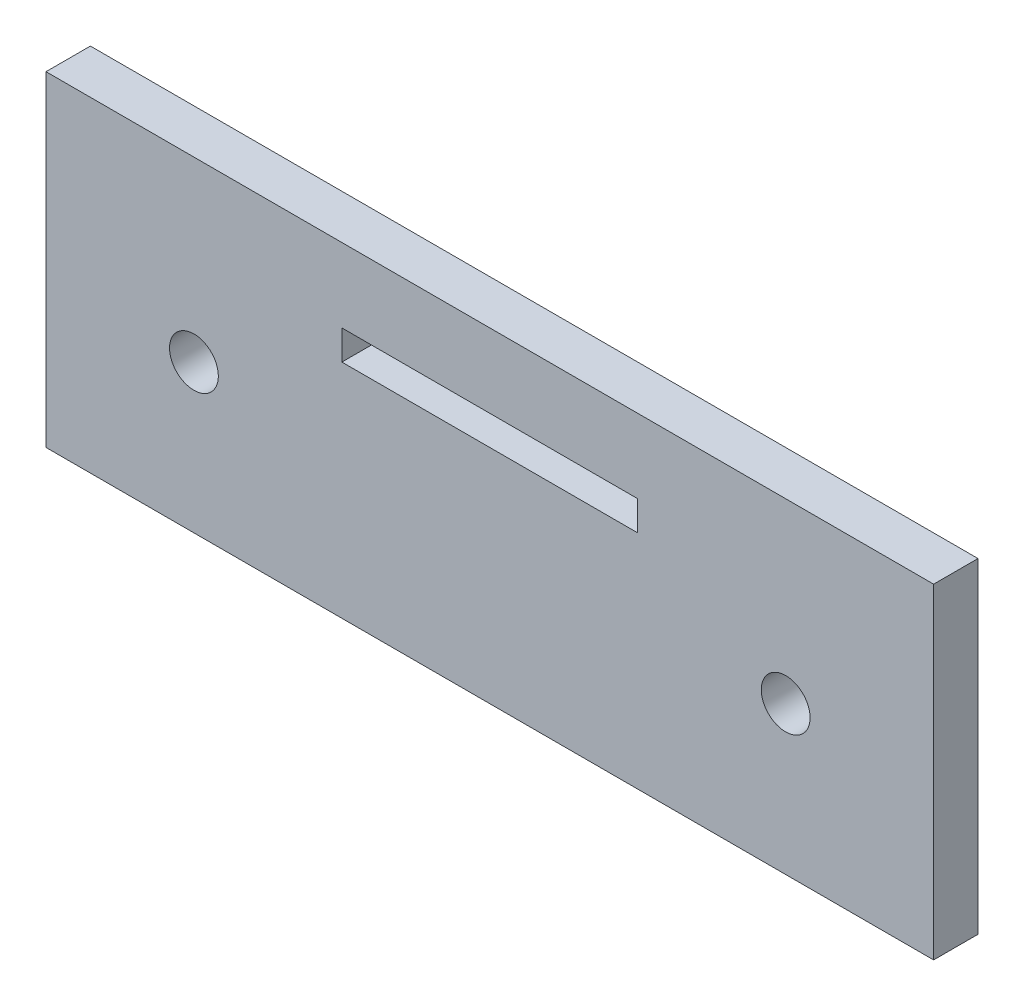
ISO-10303-21;
HEADER;
FILE_DESCRIPTION(('STEP AP214'),'2;1');
FILE_NAME('part.step','',(''),(''),'','','');
FILE_SCHEMA(('AUTOMOTIVE_DESIGN { 1 0 10303 214 1 1 1 1 }'));
ENDSEC;
DATA;
#1=APPLICATION_CONTEXT('core data for automotive mechanical design processes');
#2=APPLICATION_PROTOCOL_DEFINITION('international standard','automotive_design',2000,#1);
#3=PRODUCT_CONTEXT('',#1,'mechanical');
#4=PRODUCT('Part','Part','',(#3));
#5=PRODUCT_RELATED_PRODUCT_CATEGORY('part','',(#4));
#6=PRODUCT_DEFINITION_FORMATION('','',#4);
#7=PRODUCT_DEFINITION_CONTEXT('part definition',#1,'design');
#8=PRODUCT_DEFINITION('design','',#6,#7);
#9=PRODUCT_DEFINITION_SHAPE('','',#8);
#10=(LENGTH_UNIT() NAMED_UNIT(*) SI_UNIT(.MILLI.,.METRE.));
#11=(NAMED_UNIT(*) PLANE_ANGLE_UNIT() SI_UNIT($,.RADIAN.));
#12=(NAMED_UNIT(*) SI_UNIT($,.STERADIAN.) SOLID_ANGLE_UNIT());
#13=UNCERTAINTY_MEASURE_WITH_UNIT(LENGTH_MEASURE(1.E-05),#10,'distance_accuracy_value','');
#14=(GEOMETRIC_REPRESENTATION_CONTEXT(3) GLOBAL_UNCERTAINTY_ASSIGNED_CONTEXT((#13)) GLOBAL_UNIT_ASSIGNED_CONTEXT((#10,
#11,#12)) REPRESENTATION_CONTEXT('',''));
#15=CARTESIAN_POINT('',(0.,0.,0.));
#16=DIRECTION('',(0.,0.,1.));
#17=DIRECTION('',(1.,0.,0.));
#18=AXIS2_PLACEMENT_3D('',#15,#16,#17);
#19=CARTESIAN_POINT('',(0.,0.,-3.));
#20=DIRECTION('',(-1.,0.,0.));
#21=DIRECTION('',(0.,0.,1.));
#22=AXIS2_PLACEMENT_3D('',#19,#20,#21);
#23=PLANE('',#22);
#24=DIRECTION('',(0.,-1.,0.));
#25=VECTOR('',#24,1.);
#26=CARTESIAN_POINT('',(0.,0.,0.));
#27=LINE('',#26,#25);
#28=CARTESIAN_POINT('',(0.,22.,0.));
#29=VERTEX_POINT('',#28);
#30=CARTESIAN_POINT('',(0.,0.,0.));
#31=VERTEX_POINT('',#30);
#32=EDGE_CURVE('E159',#29,#31,#27,.T.);
#33=ORIENTED_EDGE('',*,*,#32,.F.);
#34=DIRECTION('',(0.,0.,1.));
#35=VECTOR('',#34,1.);
#36=CARTESIAN_POINT('',(0.,22.,-3.));
#37=LINE('',#36,#35);
#38=CARTESIAN_POINT('',(0.,22.,-3.));
#39=VERTEX_POINT('',#38);
#40=EDGE_CURVE('E11',#39,#29,#37,.T.);
#41=ORIENTED_EDGE('',*,*,#40,.F.);
#42=DIRECTION('',(0.,-1.,0.));
#43=VECTOR('',#42,1.);
#44=CARTESIAN_POINT('',(0.,0.,-3.));
#45=LINE('',#44,#43);
#46=CARTESIAN_POINT('',(0.,0.,-3.));
#47=VERTEX_POINT('',#46);
#48=EDGE_CURVE('E160',#39,#47,#45,.T.);
#49=ORIENTED_EDGE('',*,*,#48,.T.);
#50=DIRECTION('',(0.,0.,1.));
#51=VECTOR('',#50,1.);
#52=CARTESIAN_POINT('',(0.,0.,-3.));
#53=LINE('',#52,#51);
#54=EDGE_CURVE('E50',#47,#31,#53,.T.);
#55=ORIENTED_EDGE('',*,*,#54,.T.);
#56=EDGE_LOOP('',(#33,#41,#49,#55));
#57=FACE_BOUND('',#56,.T.);
#58=ADVANCED_FACE('F47',(#57),#23,.T.);
#59=CARTESIAN_POINT('',(0.,22.,-3.));
#60=DIRECTION('',(0.,1.,0.));
#61=DIRECTION('',(-1.,0.,0.));
#62=AXIS2_PLACEMENT_3D('',#59,#60,#61);
#63=PLANE('',#62);
#64=DIRECTION('',(-1.,0.,0.));
#65=VECTOR('',#64,1.);
#66=CARTESIAN_POINT('',(0.,22.,0.));
#67=LINE('',#66,#65);
#68=CARTESIAN_POINT('',(60.,22.,0.));
#69=VERTEX_POINT('',#68);
#70=EDGE_CURVE('E165',#69,#29,#67,.T.);
#71=ORIENTED_EDGE('',*,*,#70,.F.);
#72=DIRECTION('',(0.,0.,1.));
#73=VECTOR('',#72,1.);
#74=CARTESIAN_POINT('',(60.,22.,-3.));
#75=LINE('',#74,#73);
#76=CARTESIAN_POINT('',(60.,22.,-3.));
#77=VERTEX_POINT('',#76);
#78=EDGE_CURVE('E56',#77,#69,#75,.T.);
#79=ORIENTED_EDGE('',*,*,#78,.F.);
#80=DIRECTION('',(-1.,0.,0.));
#81=VECTOR('',#80,1.);
#82=CARTESIAN_POINT('',(0.,22.,-3.));
#83=LINE('',#82,#81);
#84=EDGE_CURVE('E173',#77,#39,#83,.T.);
#85=ORIENTED_EDGE('',*,*,#84,.T.);
#86=ORIENTED_EDGE('',*,*,#40,.T.);
#87=EDGE_LOOP('',(#71,#79,#85,#86));
#88=FACE_BOUND('',#87,.T.);
#89=ADVANCED_FACE('F205',(#88),#63,.T.);
#90=CARTESIAN_POINT('',(60.,0.,-3.));
#91=DIRECTION('',(1.,0.,0.));
#92=DIRECTION('',(0.,0.,-1.));
#93=AXIS2_PLACEMENT_3D('',#90,#91,#92);
#94=PLANE('',#93);
#95=DIRECTION('',(0.,1.,0.));
#96=VECTOR('',#95,1.);
#97=CARTESIAN_POINT('',(60.,0.,0.));
#98=LINE('',#97,#96);
#99=CARTESIAN_POINT('',(60.,0.,0.));
#100=VERTEX_POINT('',#99);
#101=EDGE_CURVE('E184',#100,#69,#98,.T.);
#102=ORIENTED_EDGE('',*,*,#101,.F.);
#103=DIRECTION('',(0.,0.,1.));
#104=VECTOR('',#103,1.);
#105=CARTESIAN_POINT('',(60.,0.,-3.));
#106=LINE('',#105,#104);
#107=CARTESIAN_POINT('',(60.,0.,-3.));
#108=VERTEX_POINT('',#107);
#109=EDGE_CURVE('E192',#108,#100,#106,.T.);
#110=ORIENTED_EDGE('',*,*,#109,.F.);
#111=DIRECTION('',(0.,1.,0.));
#112=VECTOR('',#111,1.);
#113=CARTESIAN_POINT('',(60.,0.,-3.));
#114=LINE('',#113,#112);
#115=EDGE_CURVE('E169',#108,#77,#114,.T.);
#116=ORIENTED_EDGE('',*,*,#115,.T.);
#117=ORIENTED_EDGE('',*,*,#78,.T.);
#118=EDGE_LOOP('',(#102,#110,#116,#117));
#119=FACE_BOUND('',#118,.T.);
#120=ADVANCED_FACE('F211',(#119),#94,.T.);
#121=CARTESIAN_POINT('',(0.,0.,-3.));
#122=DIRECTION('',(0.,-1.,0.));
#123=DIRECTION('',(0.,0.,-1.));
#124=AXIS2_PLACEMENT_3D('',#121,#122,#123);
#125=PLANE('',#124);
#126=DIRECTION('',(1.,0.,0.));
#127=VECTOR('',#126,1.);
#128=CARTESIAN_POINT('',(0.,0.,0.));
#129=LINE('',#128,#127);
#130=EDGE_CURVE('E180',#31,#100,#129,.T.);
#131=ORIENTED_EDGE('',*,*,#130,.F.);
#132=ORIENTED_EDGE('',*,*,#54,.F.);
#133=DIRECTION('',(1.,0.,0.));
#134=VECTOR('',#133,1.);
#135=CARTESIAN_POINT('',(0.,0.,-3.));
#136=LINE('',#135,#134);
#137=EDGE_CURVE('E164',#47,#108,#136,.T.);
#138=ORIENTED_EDGE('',*,*,#137,.T.);
#139=ORIENTED_EDGE('',*,*,#109,.T.);
#140=EDGE_LOOP('',(#131,#132,#138,#139));
#141=FACE_BOUND('',#140,.T.);
#142=ADVANCED_FACE('F202',(#141),#125,.T.);
#143=CARTESIAN_POINT('',(0.,0.,-3.));
#144=DIRECTION('',(0.,0.,-1.));
#145=DIRECTION('',(-1.,0.,0.));
#146=AXIS2_PLACEMENT_3D('',#143,#144,#145);
#147=PLANE('',#146);
#148=CARTESIAN_POINT('',(10.,10.,-3.));
#149=DIRECTION('',(0.,0.,-1.));
#150=DIRECTION('',(-1.,0.,0.));
#151=AXIS2_PLACEMENT_3D('',#148,#149,#150);
#152=CIRCLE('',#151,1.65);
#153=CARTESIAN_POINT('',(8.35,10.,-3.));
#154=VERTEX_POINT('',#153);
#155=EDGE_CURVE('E342',#154,#154,#152,.T.);
#156=ORIENTED_EDGE('',*,*,#155,.F.);
#157=EDGE_LOOP('',(#156));
#158=FACE_BOUND('',#157,.T.);
#159=CARTESIAN_POINT('',(50.,10.,-3.));
#160=DIRECTION('',(0.,0.,-1.));
#161=DIRECTION('',(-1.,0.,0.));
#162=AXIS2_PLACEMENT_3D('',#159,#160,#161);
#163=CIRCLE('',#162,1.65);
#164=CARTESIAN_POINT('',(48.35,10.,-3.));
#165=VERTEX_POINT('',#164);
#166=EDGE_CURVE('E347',#165,#165,#163,.T.);
#167=ORIENTED_EDGE('',*,*,#166,.F.);
#168=EDGE_LOOP('',(#167));
#169=FACE_BOUND('',#168,.T.);
#170=DIRECTION('',(0.,1.,0.));
#171=VECTOR('',#170,1.);
#172=CARTESIAN_POINT('',(20.,0.,-3.));
#173=LINE('',#172,#171);
#174=CARTESIAN_POINT('',(20.,15.,-3.));
#175=VERTEX_POINT('',#174);
#176=CARTESIAN_POINT('',(20.,17.,-3.));
#177=VERTEX_POINT('',#176);
#178=EDGE_CURVE('E156',#175,#177,#173,.T.);
#179=ORIENTED_EDGE('',*,*,#178,.F.);
#180=DIRECTION('',(-1.,0.,0.));
#181=VECTOR('',#180,1.);
#182=CARTESIAN_POINT('',(0.,15.,-3.));
#183=LINE('',#182,#181);
#184=CARTESIAN_POINT('',(40.,15.,-3.));
#185=VERTEX_POINT('',#184);
#186=EDGE_CURVE('E144',#185,#175,#183,.T.);
#187=ORIENTED_EDGE('',*,*,#186,.F.);
#188=DIRECTION('',(0.,-1.,0.));
#189=VECTOR('',#188,1.);
#190=CARTESIAN_POINT('',(40.,0.,-3.));
#191=LINE('',#190,#189);
#192=CARTESIAN_POINT('',(40.,17.,-3.));
#193=VERTEX_POINT('',#192);
#194=EDGE_CURVE('E119',#193,#185,#191,.T.);
#195=ORIENTED_EDGE('',*,*,#194,.F.);
#196=DIRECTION('',(1.,0.,0.));
#197=VECTOR('',#196,1.);
#198=CARTESIAN_POINT('',(0.,17.,-3.));
#199=LINE('',#198,#197);
#200=EDGE_CURVE('E153',#177,#193,#199,.T.);
#201=ORIENTED_EDGE('',*,*,#200,.F.);
#202=EDGE_LOOP('',(#179,#187,#195,#201));
#203=FACE_BOUND('',#202,.T.);
#204=ORIENTED_EDGE('',*,*,#48,.F.);
#205=ORIENTED_EDGE('',*,*,#84,.F.);
#206=ORIENTED_EDGE('',*,*,#115,.F.);
#207=ORIENTED_EDGE('',*,*,#137,.F.);
#208=EDGE_LOOP('',(#204,#205,#206,#207));
#209=FACE_BOUND('',#208,.T.);
#210=ADVANCED_FACE('F208',(#158,#169,#203,#209),#147,.T.);
#211=CARTESIAN_POINT('',(0.,0.,0.));
#212=DIRECTION('',(0.,0.,-1.));
#213=DIRECTION('',(-1.,0.,0.));
#214=AXIS2_PLACEMENT_3D('',#211,#212,#213);
#215=PLANE('',#214);
#216=CARTESIAN_POINT('',(10.,10.,0.));
#217=DIRECTION('',(0.,0.,1.));
#218=DIRECTION('',(1.,0.,0.));
#219=AXIS2_PLACEMENT_3D('',#216,#217,#218);
#220=CIRCLE('',#219,1.65);
#221=CARTESIAN_POINT('',(11.65,10.,0.));
#222=VERTEX_POINT('',#221);
#223=EDGE_CURVE('E345',#222,#222,#220,.T.);
#224=ORIENTED_EDGE('',*,*,#223,.F.);
#225=EDGE_LOOP('',(#224));
#226=FACE_BOUND('',#225,.T.);
#227=CARTESIAN_POINT('',(50.,10.,0.));
#228=DIRECTION('',(0.,0.,1.));
#229=DIRECTION('',(1.,0.,0.));
#230=AXIS2_PLACEMENT_3D('',#227,#228,#229);
#231=CIRCLE('',#230,1.65);
#232=CARTESIAN_POINT('',(51.65,10.,0.));
#233=VERTEX_POINT('',#232);
#234=EDGE_CURVE('E348',#233,#233,#231,.T.);
#235=ORIENTED_EDGE('',*,*,#234,.F.);
#236=EDGE_LOOP('',(#235));
#237=FACE_BOUND('',#236,.T.);
#238=DIRECTION('',(1.,0.,0.));
#239=VECTOR('',#238,1.);
#240=CARTESIAN_POINT('',(20.,15.,0.));
#241=LINE('',#240,#239);
#242=CARTESIAN_POINT('',(20.,15.,0.));
#243=VERTEX_POINT('',#242);
#244=CARTESIAN_POINT('',(40.,15.,0.));
#245=VERTEX_POINT('',#244);
#246=EDGE_CURVE('E126',#243,#245,#241,.T.);
#247=ORIENTED_EDGE('',*,*,#246,.F.);
#248=DIRECTION('',(0.,-1.,0.));
#249=VECTOR('',#248,1.);
#250=CARTESIAN_POINT('',(20.,17.,0.));
#251=LINE('',#250,#249);
#252=CARTESIAN_POINT('',(20.,17.,0.));
#253=VERTEX_POINT('',#252);
#254=EDGE_CURVE('E72',#253,#243,#251,.T.);
#255=ORIENTED_EDGE('',*,*,#254,.F.);
#256=DIRECTION('',(-1.,0.,0.));
#257=VECTOR('',#256,1.);
#258=CARTESIAN_POINT('',(20.,17.,0.));
#259=LINE('',#258,#257);
#260=CARTESIAN_POINT('',(40.,17.,0.));
#261=VERTEX_POINT('',#260);
#262=EDGE_CURVE('E134',#261,#253,#259,.T.);
#263=ORIENTED_EDGE('',*,*,#262,.F.);
#264=DIRECTION('',(0.,1.,0.));
#265=VECTOR('',#264,1.);
#266=CARTESIAN_POINT('',(40.,17.,0.));
#267=LINE('',#266,#265);
#268=EDGE_CURVE('E116',#245,#261,#267,.T.);
#269=ORIENTED_EDGE('',*,*,#268,.F.);
#270=EDGE_LOOP('',(#247,#255,#263,#269));
#271=FACE_BOUND('',#270,.T.);
#272=ORIENTED_EDGE('',*,*,#32,.T.);
#273=ORIENTED_EDGE('',*,*,#130,.T.);
#274=ORIENTED_EDGE('',*,*,#101,.T.);
#275=ORIENTED_EDGE('',*,*,#70,.T.);
#276=EDGE_LOOP('',(#272,#273,#274,#275));
#277=FACE_BOUND('',#276,.T.);
#278=ADVANCED_FACE('F131',(#226,#237,#271,#277),#215,.F.);
#279=CARTESIAN_POINT('',(20.,17.,-30.));
#280=DIRECTION('',(-1.,0.,0.));
#281=DIRECTION('',(0.,-1.,0.));
#282=AXIS2_PLACEMENT_3D('',#279,#280,#281);
#283=PLANE('',#282);
#284=ORIENTED_EDGE('',*,*,#178,.T.);
#285=DIRECTION('',(0.,0.,1.));
#286=VECTOR('',#285,1.);
#287=CARTESIAN_POINT('',(20.,17.,-30.));
#288=LINE('',#287,#286);
#289=EDGE_CURVE('E141',#177,#253,#288,.T.);
#290=ORIENTED_EDGE('',*,*,#289,.T.);
#291=ORIENTED_EDGE('',*,*,#254,.T.);
#292=DIRECTION('',(0.,0.,1.));
#293=VECTOR('',#292,1.);
#294=CARTESIAN_POINT('',(20.,15.,-30.));
#295=LINE('',#294,#293);
#296=EDGE_CURVE('E123',#175,#243,#295,.T.);
#297=ORIENTED_EDGE('',*,*,#296,.F.);
#298=EDGE_LOOP('',(#284,#290,#291,#297));
#299=FACE_BOUND('',#298,.T.);
#300=ADVANCED_FACE('F262',(#299),#283,.F.);
#301=CARTESIAN_POINT('',(20.,17.,-30.));
#302=DIRECTION('',(0.,1.,0.));
#303=DIRECTION('',(0.,0.,1.));
#304=AXIS2_PLACEMENT_3D('',#301,#302,#303);
#305=PLANE('',#304);
#306=ORIENTED_EDGE('',*,*,#200,.T.);
#307=DIRECTION('',(0.,0.,1.));
#308=VECTOR('',#307,1.);
#309=CARTESIAN_POINT('',(40.,17.,-30.));
#310=LINE('',#309,#308);
#311=EDGE_CURVE('E122',#193,#261,#310,.T.);
#312=ORIENTED_EDGE('',*,*,#311,.T.);
#313=ORIENTED_EDGE('',*,*,#262,.T.);
#314=ORIENTED_EDGE('',*,*,#289,.F.);
#315=EDGE_LOOP('',(#306,#312,#313,#314));
#316=FACE_BOUND('',#315,.T.);
#317=ADVANCED_FACE('F273',(#316),#305,.F.);
#318=CARTESIAN_POINT('',(40.,17.,-30.));
#319=DIRECTION('',(1.,0.,0.));
#320=DIRECTION('',(0.,0.,-1.));
#321=AXIS2_PLACEMENT_3D('',#318,#319,#320);
#322=PLANE('',#321);
#323=ORIENTED_EDGE('',*,*,#194,.T.);
#324=DIRECTION('',(0.,0.,1.));
#325=VECTOR('',#324,1.);
#326=CARTESIAN_POINT('',(40.,15.,-30.));
#327=LINE('',#326,#325);
#328=EDGE_CURVE('E64',#185,#245,#327,.T.);
#329=ORIENTED_EDGE('',*,*,#328,.T.);
#330=ORIENTED_EDGE('',*,*,#268,.T.);
#331=ORIENTED_EDGE('',*,*,#311,.F.);
#332=EDGE_LOOP('',(#323,#329,#330,#331));
#333=FACE_BOUND('',#332,.T.);
#334=ADVANCED_FACE('F113',(#333),#322,.F.);
#335=CARTESIAN_POINT('',(20.,15.,-30.));
#336=DIRECTION('',(0.,-1.,0.));
#337=DIRECTION('',(0.,0.,-1.));
#338=AXIS2_PLACEMENT_3D('',#335,#336,#337);
#339=PLANE('',#338);
#340=ORIENTED_EDGE('',*,*,#186,.T.);
#341=ORIENTED_EDGE('',*,*,#296,.T.);
#342=ORIENTED_EDGE('',*,*,#246,.T.);
#343=ORIENTED_EDGE('',*,*,#328,.F.);
#344=EDGE_LOOP('',(#340,#341,#342,#343));
#345=FACE_BOUND('',#344,.T.);
#346=ADVANCED_FACE('F127',(#345),#339,.F.);
#347=CARTESIAN_POINT('',(50.,10.,-10.));
#348=DIRECTION('',(0.,0.,1.));
#349=DIRECTION('',(1.,0.,0.));
#350=AXIS2_PLACEMENT_3D('',#347,#348,#349);
#351=CYLINDRICAL_SURFACE('',#350,1.65);
#352=ORIENTED_EDGE('',*,*,#166,.T.);
#353=EDGE_LOOP('',(#352));
#354=FACE_BOUND('',#353,.T.);
#355=ORIENTED_EDGE('',*,*,#234,.T.);
#356=EDGE_LOOP('',(#355));
#357=FACE_BOUND('',#356,.T.);
#358=ADVANCED_FACE('F301',(#354,#357),#351,.F.);
#359=CARTESIAN_POINT('',(10.,10.,-10.));
#360=DIRECTION('',(0.,0.,1.));
#361=DIRECTION('',(1.,0.,0.));
#362=AXIS2_PLACEMENT_3D('',#359,#360,#361);
#363=CYLINDRICAL_SURFACE('',#362,1.65);
#364=ORIENTED_EDGE('',*,*,#155,.T.);
#365=EDGE_LOOP('',(#364));
#366=FACE_BOUND('',#365,.T.);
#367=ORIENTED_EDGE('',*,*,#223,.T.);
#368=EDGE_LOOP('',(#367));
#369=FACE_BOUND('',#368,.T.);
#370=ADVANCED_FACE('F310',(#366,#369),#363,.F.);
#371=CLOSED_SHELL('',(#58,#89,#120,#142,#210,#278,#300,#317,#334,#346,#358,#370));
#372=MANIFOLD_SOLID_BREP('B2',#371);
#373=ADVANCED_BREP_SHAPE_REPRESENTATION('',(#18,#372),#14);
#374=SHAPE_DEFINITION_REPRESENTATION(#9,#373);
ENDSEC;
END-ISO-10303-21;
